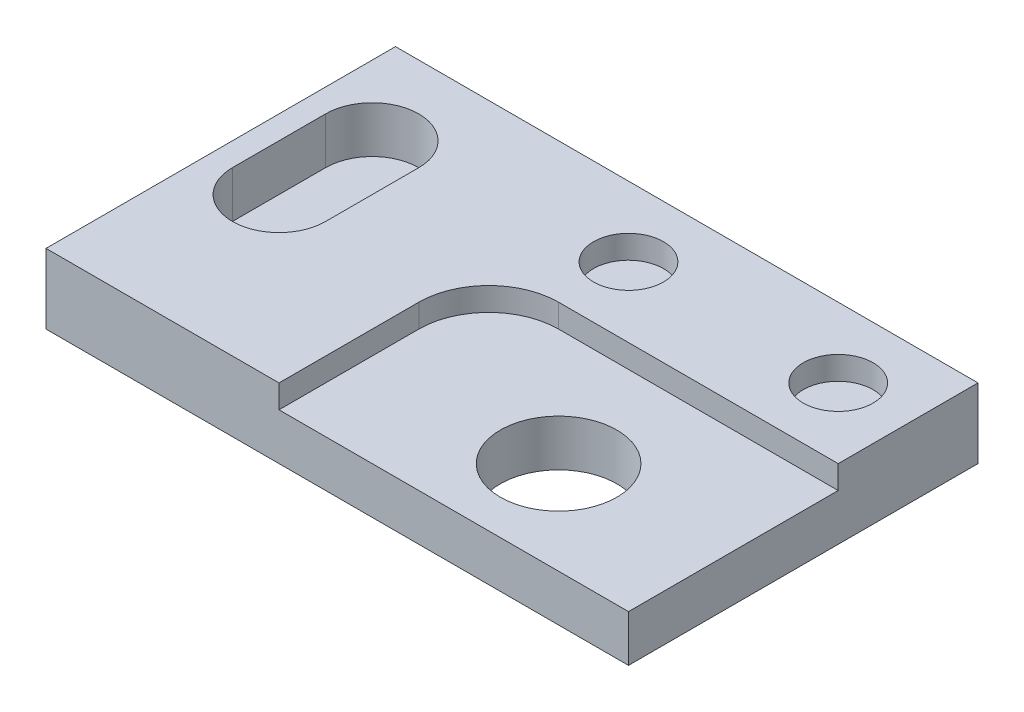
ISO-10303-21;
HEADER;
FILE_DESCRIPTION(('STEP AP214'),'2;1');
FILE_NAME('part.step','',(''),(''),'','','');
FILE_SCHEMA(('AUTOMOTIVE_DESIGN { 1 0 10303 214 1 1 1 1 }'));
ENDSEC;
DATA;
#1=APPLICATION_CONTEXT('core data for automotive mechanical design processes');
#2=APPLICATION_PROTOCOL_DEFINITION('international standard','automotive_design',2000,#1);
#3=PRODUCT_CONTEXT('',#1,'mechanical');
#4=PRODUCT('Part','Part','',(#3));
#5=PRODUCT_RELATED_PRODUCT_CATEGORY('part','',(#4));
#6=PRODUCT_DEFINITION_FORMATION('','',#4);
#7=PRODUCT_DEFINITION_CONTEXT('part definition',#1,'design');
#8=PRODUCT_DEFINITION('design','',#6,#7);
#9=PRODUCT_DEFINITION_SHAPE('','',#8);
#10=(LENGTH_UNIT() NAMED_UNIT(*) SI_UNIT(.MILLI.,.METRE.));
#11=(NAMED_UNIT(*) PLANE_ANGLE_UNIT() SI_UNIT($,.RADIAN.));
#12=(NAMED_UNIT(*) SI_UNIT($,.STERADIAN.) SOLID_ANGLE_UNIT());
#13=UNCERTAINTY_MEASURE_WITH_UNIT(LENGTH_MEASURE(1.E-05),#10,'distance_accuracy_value','');
#14=(GEOMETRIC_REPRESENTATION_CONTEXT(3) GLOBAL_UNCERTAINTY_ASSIGNED_CONTEXT((#13)) GLOBAL_UNIT_ASSIGNED_CONTEXT((#10,
#11,#12)) REPRESENTATION_CONTEXT('',''));
#15=CARTESIAN_POINT('',(0.,0.,0.));
#16=DIRECTION('',(0.,0.,1.));
#17=DIRECTION('',(1.,0.,0.));
#18=AXIS2_PLACEMENT_3D('',#15,#16,#17);
#19=CARTESIAN_POINT('',(-125.,-30.,75.));
#20=DIRECTION('',(0.,0.,1.));
#21=DIRECTION('',(1.,0.,0.));
#22=AXIS2_PLACEMENT_3D('',#19,#20,#21);
#23=PLANE('',#22);
#24=DIRECTION('',(1.,0.,0.));
#25=VECTOR('',#24,1.);
#26=CARTESIAN_POINT('',(0.,-10.,75.));
#27=LINE('',#26,#25);
#28=CARTESIAN_POINT('',(-25.,-10.,75.));
#29=VERTEX_POINT('',#28);
#30=CARTESIAN_POINT('',(125.,-10.,75.));
#31=VERTEX_POINT('',#30);
#32=EDGE_CURVE('E212',#29,#31,#27,.T.);
#33=ORIENTED_EDGE('',*,*,#32,.F.);
#34=DIRECTION('',(0.,1.,0.));
#35=VECTOR('',#34,1.);
#36=CARTESIAN_POINT('',(-25.,-10.,75.));
#37=LINE('',#36,#35);
#38=CARTESIAN_POINT('',(-25.,0.,75.));
#39=VERTEX_POINT('',#38);
#40=EDGE_CURVE('E232',#29,#39,#37,.T.);
#41=ORIENTED_EDGE('',*,*,#40,.T.);
#42=DIRECTION('',(1.,0.,0.));
#43=VECTOR('',#42,1.);
#44=CARTESIAN_POINT('',(-125.,0.,75.));
#45=LINE('',#44,#43);
#46=CARTESIAN_POINT('',(-125.,0.,75.));
#47=VERTEX_POINT('',#46);
#48=EDGE_CURVE('E328',#47,#39,#45,.T.);
#49=ORIENTED_EDGE('',*,*,#48,.F.);
#50=DIRECTION('',(0.,1.,0.));
#51=VECTOR('',#50,1.);
#52=CARTESIAN_POINT('',(-125.,-30.,75.));
#53=LINE('',#52,#51);
#54=CARTESIAN_POINT('',(-125.,-30.,75.));
#55=VERTEX_POINT('',#54);
#56=EDGE_CURVE('E82',#55,#47,#53,.T.);
#57=ORIENTED_EDGE('',*,*,#56,.F.);
#58=DIRECTION('',(1.,0.,0.));
#59=VECTOR('',#58,1.);
#60=CARTESIAN_POINT('',(-125.,-30.,75.));
#61=LINE('',#60,#59);
#62=CARTESIAN_POINT('',(125.,-30.,75.));
#63=VERTEX_POINT('',#62);
#64=EDGE_CURVE('E336',#55,#63,#61,.T.);
#65=ORIENTED_EDGE('',*,*,#64,.T.);
#66=DIRECTION('',(0.,1.,0.));
#67=VECTOR('',#66,1.);
#68=CARTESIAN_POINT('',(125.,-30.,75.));
#69=LINE('',#68,#67);
#70=EDGE_CURVE('E13',#63,#31,#69,.T.);
#71=ORIENTED_EDGE('',*,*,#70,.T.);
#72=EDGE_LOOP('',(#33,#41,#49,#57,#65,#71));
#73=FACE_BOUND('',#72,.T.);
#74=ADVANCED_FACE('F72',(#73),#23,.T.);
#75=CARTESIAN_POINT('',(55.,-30.,35.));
#76=DIRECTION('',(0.,1.,0.));
#77=DIRECTION('',(0.,0.,1.));
#78=AXIS2_PLACEMENT_3D('',#75,#76,#77);
#79=CYLINDRICAL_SURFACE('',#78,25.);
#80=CARTESIAN_POINT('',(55.,-30.,35.));
#81=DIRECTION('',(0.,1.,0.));
#82=DIRECTION('',(0.,0.,1.));
#83=AXIS2_PLACEMENT_3D('',#80,#81,#82);
#84=CIRCLE('',#83,25.);
#85=CARTESIAN_POINT('',(55.,-30.,60.));
#86=VERTEX_POINT('',#85);
#87=EDGE_CURVE('E231',#86,#86,#84,.T.);
#88=ORIENTED_EDGE('',*,*,#87,.F.);
#89=EDGE_LOOP('',(#88));
#90=FACE_BOUND('',#89,.T.);
#91=CARTESIAN_POINT('',(55.,-10.,35.));
#92=DIRECTION('',(0.,1.,0.));
#93=DIRECTION('',(0.,0.,1.));
#94=AXIS2_PLACEMENT_3D('',#91,#92,#93);
#95=CIRCLE('',#94,25.);
#96=CARTESIAN_POINT('',(55.,-10.,60.));
#97=VERTEX_POINT('',#96);
#98=EDGE_CURVE('E187',#97,#97,#95,.T.);
#99=ORIENTED_EDGE('',*,*,#98,.T.);
#100=EDGE_LOOP('',(#99));
#101=FACE_BOUND('',#100,.T.);
#102=ADVANCED_FACE('F392',(#90,#101),#79,.F.);
#103=CARTESIAN_POINT('',(125.,-30.,-75.));
#104=DIRECTION('',(1.,0.,0.));
#105=DIRECTION('',(0.,0.,-1.));
#106=AXIS2_PLACEMENT_3D('',#103,#104,#105);
#107=PLANE('',#106);
#108=DIRECTION('',(0.,1.,0.));
#109=VECTOR('',#108,1.);
#110=CARTESIAN_POINT('',(125.,-10.,-15.));
#111=LINE('',#110,#109);
#112=CARTESIAN_POINT('',(125.,-10.,-15.));
#113=VERTEX_POINT('',#112);
#114=CARTESIAN_POINT('',(125.,0.,-15.));
#115=VERTEX_POINT('',#114);
#116=EDGE_CURVE('E227',#113,#115,#111,.T.);
#117=ORIENTED_EDGE('',*,*,#116,.F.);
#118=DIRECTION('',(0.,0.,-1.));
#119=VECTOR('',#118,1.);
#120=CARTESIAN_POINT('',(125.,-10.,0.));
#121=LINE('',#120,#119);
#122=EDGE_CURVE('E172',#31,#113,#121,.T.);
#123=ORIENTED_EDGE('',*,*,#122,.F.);
#124=ORIENTED_EDGE('',*,*,#70,.F.);
#125=DIRECTION('',(0.,0.,-1.));
#126=VECTOR('',#125,1.);
#127=CARTESIAN_POINT('',(125.,-30.,-75.));
#128=LINE('',#127,#126);
#129=CARTESIAN_POINT('',(125.,-30.,-75.));
#130=VERTEX_POINT('',#129);
#131=EDGE_CURVE('E323',#63,#130,#128,.T.);
#132=ORIENTED_EDGE('',*,*,#131,.T.);
#133=DIRECTION('',(0.,1.,0.));
#134=VECTOR('',#133,1.);
#135=CARTESIAN_POINT('',(125.,-30.,-75.));
#136=LINE('',#135,#134);
#137=CARTESIAN_POINT('',(125.,0.,-75.));
#138=VERTEX_POINT('',#137);
#139=EDGE_CURVE('E76',#130,#138,#136,.T.);
#140=ORIENTED_EDGE('',*,*,#139,.T.);
#141=DIRECTION('',(0.,0.,-1.));
#142=VECTOR('',#141,1.);
#143=CARTESIAN_POINT('',(125.,0.,-75.));
#144=LINE('',#143,#142);
#145=EDGE_CURVE('E311',#115,#138,#144,.T.);
#146=ORIENTED_EDGE('',*,*,#145,.F.);
#147=EDGE_LOOP('',(#117,#123,#124,#132,#140,#146));
#148=FACE_BOUND('',#147,.T.);
#149=ADVANCED_FACE('F74',(#148),#107,.T.);
#150=CARTESIAN_POINT('',(-125.,-30.,-75.));
#151=DIRECTION('',(-1.,0.,0.));
#152=DIRECTION('',(0.,0.,1.));
#153=AXIS2_PLACEMENT_3D('',#150,#151,#152);
#154=PLANE('',#153);
#155=DIRECTION('',(0.,0.,1.));
#156=VECTOR('',#155,1.);
#157=CARTESIAN_POINT('',(-125.,0.,-75.));
#158=LINE('',#157,#156);
#159=CARTESIAN_POINT('',(-125.,0.,-75.));
#160=VERTEX_POINT('',#159);
#161=EDGE_CURVE('E346',#160,#47,#158,.T.);
#162=ORIENTED_EDGE('',*,*,#161,.F.);
#163=DIRECTION('',(0.,1.,0.));
#164=VECTOR('',#163,1.);
#165=CARTESIAN_POINT('',(-125.,-30.,-75.));
#166=LINE('',#165,#164);
#167=CARTESIAN_POINT('',(-125.,-30.,-75.));
#168=VERTEX_POINT('',#167);
#169=EDGE_CURVE('E354',#168,#160,#166,.T.);
#170=ORIENTED_EDGE('',*,*,#169,.F.);
#171=DIRECTION('',(0.,0.,1.));
#172=VECTOR('',#171,1.);
#173=CARTESIAN_POINT('',(-125.,-30.,-75.));
#174=LINE('',#173,#172);
#175=EDGE_CURVE('E332',#168,#55,#174,.T.);
#176=ORIENTED_EDGE('',*,*,#175,.T.);
#177=ORIENTED_EDGE('',*,*,#56,.T.);
#178=EDGE_LOOP('',(#162,#170,#176,#177));
#179=FACE_BOUND('',#178,.T.);
#180=ADVANCED_FACE('F385',(#179),#154,.T.);
#181=CARTESIAN_POINT('',(-125.,-30.,-75.));
#182=DIRECTION('',(0.,0.,-1.));
#183=DIRECTION('',(-1.,0.,0.));
#184=AXIS2_PLACEMENT_3D('',#181,#182,#183);
#185=PLANE('',#184);
#186=DIRECTION('',(-1.,0.,0.));
#187=VECTOR('',#186,1.);
#188=CARTESIAN_POINT('',(-125.,0.,-75.));
#189=LINE('',#188,#187);
#190=EDGE_CURVE('E342',#138,#160,#189,.T.);
#191=ORIENTED_EDGE('',*,*,#190,.F.);
#192=ORIENTED_EDGE('',*,*,#139,.F.);
#193=DIRECTION('',(-1.,0.,0.));
#194=VECTOR('',#193,1.);
#195=CARTESIAN_POINT('',(-125.,-30.,-75.));
#196=LINE('',#195,#194);
#197=EDGE_CURVE('E327',#130,#168,#196,.T.);
#198=ORIENTED_EDGE('',*,*,#197,.T.);
#199=ORIENTED_EDGE('',*,*,#169,.T.);
#200=EDGE_LOOP('',(#191,#192,#198,#199));
#201=FACE_BOUND('',#200,.T.);
#202=ADVANCED_FACE('F365',(#201),#185,.T.);
#203=CARTESIAN_POINT('',(0.,-30.,0.));
#204=DIRECTION('',(0.,1.,0.));
#205=DIRECTION('',(0.,0.,1.));
#206=AXIS2_PLACEMENT_3D('',#203,#204,#205);
#207=PLANE('',#206);
#208=ORIENTED_EDGE('',*,*,#87,.T.);
#209=EDGE_LOOP('',(#208));
#210=FACE_BOUND('',#209,.T.);
#211=ORIENTED_EDGE('',*,*,#131,.F.);
#212=ORIENTED_EDGE('',*,*,#64,.F.);
#213=ORIENTED_EDGE('',*,*,#175,.F.);
#214=ORIENTED_EDGE('',*,*,#197,.F.);
#215=EDGE_LOOP('',(#211,#212,#213,#214));
#216=FACE_BOUND('',#215,.T.);
#217=ADVANCED_FACE('F382',(#210,#216),#207,.F.);
#218=CARTESIAN_POINT('',(0.,0.,0.));
#219=DIRECTION('',(0.,1.,0.));
#220=DIRECTION('',(0.,0.,1.));
#221=AXIS2_PLACEMENT_3D('',#218,#219,#220);
#222=PLANE('',#221);
#223=DIRECTION('',(-1.,0.,0.));
#224=VECTOR('',#223,1.);
#225=CARTESIAN_POINT('',(0.,0.,-15.));
#226=LINE('',#225,#224);
#227=CARTESIAN_POINT('',(5.00000000000019,0.,-15.));
#228=VERTEX_POINT('',#227);
#229=EDGE_CURVE('E90',#115,#228,#226,.T.);
#230=ORIENTED_EDGE('',*,*,#229,.F.);
#231=ORIENTED_EDGE('',*,*,#145,.T.);
#232=ORIENTED_EDGE('',*,*,#190,.T.);
#233=ORIENTED_EDGE('',*,*,#161,.T.);
#234=ORIENTED_EDGE('',*,*,#48,.T.);
#235=DIRECTION('',(0.,0.,-1.));
#236=VECTOR('',#235,1.);
#237=CARTESIAN_POINT('',(-25.,0.,0.));
#238=LINE('',#237,#236);
#239=CARTESIAN_POINT('',(-25.,0.,15.0000000000002));
#240=VERTEX_POINT('',#239);
#241=EDGE_CURVE('E195',#39,#240,#238,.T.);
#242=ORIENTED_EDGE('',*,*,#241,.T.);
#243=CARTESIAN_POINT('',(4.99999999999998,0.,15.));
#244=DIRECTION('',(0.,1.,0.));
#245=DIRECTION('',(0.,0.,1.));
#246=AXIS2_PLACEMENT_3D('',#243,#244,#245);
#247=CIRCLE('',#246,30.);
#248=EDGE_CURVE('E216',#228,#240,#247,.T.);
#249=ORIENTED_EDGE('',*,*,#248,.F.);
#250=EDGE_LOOP('',(#230,#231,#232,#233,#234,#242,#249));
#251=FACE_BOUND('',#250,.T.);
#252=CARTESIAN_POINT('',(4.99999999999998,0.,-45.));
#253=DIRECTION('',(0.,1.,0.));
#254=DIRECTION('',(0.,0.,1.));
#255=AXIS2_PLACEMENT_3D('',#252,#253,#254);
#256=CIRCLE('',#255,15.);
#257=CARTESIAN_POINT('',(4.99999999999998,0.,-30.));
#258=VERTEX_POINT('',#257);
#259=EDGE_CURVE('E254',#258,#258,#256,.T.);
#260=ORIENTED_EDGE('',*,*,#259,.F.);
#261=EDGE_LOOP('',(#260));
#262=FACE_BOUND('',#261,.T.);
#263=CARTESIAN_POINT('',(95.,0.,-45.));
#264=DIRECTION('',(0.,1.,0.));
#265=DIRECTION('',(0.,0.,1.));
#266=AXIS2_PLACEMENT_3D('',#263,#264,#265);
#267=CIRCLE('',#266,15.);
#268=CARTESIAN_POINT('',(95.,0.,-30.));
#269=VERTEX_POINT('',#268);
#270=EDGE_CURVE('E247',#269,#269,#267,.T.);
#271=ORIENTED_EDGE('',*,*,#270,.F.);
#272=EDGE_LOOP('',(#271));
#273=FACE_BOUND('',#272,.T.);
#274=DIRECTION('',(0.,0.,1.));
#275=VECTOR('',#274,1.);
#276=CARTESIAN_POINT('',(-115.,0.,0.));
#277=LINE('',#276,#275);
#278=CARTESIAN_POINT('',(-115.,0.,-35.));
#279=VERTEX_POINT('',#278);
#280=CARTESIAN_POINT('',(-115.,0.,5.));
#281=VERTEX_POINT('',#280);
#282=EDGE_CURVE('E253',#279,#281,#277,.T.);
#283=ORIENTED_EDGE('',*,*,#282,.F.);
#284=CARTESIAN_POINT('',(-95.,0.,-35.));
#285=DIRECTION('',(0.,1.,0.));
#286=DIRECTION('',(0.,0.,1.));
#287=AXIS2_PLACEMENT_3D('',#284,#285,#286);
#288=CIRCLE('',#287,20.);
#289=CARTESIAN_POINT('',(-75.,0.,-35.));
#290=VERTEX_POINT('',#289);
#291=EDGE_CURVE('E276',#290,#279,#288,.T.);
#292=ORIENTED_EDGE('',*,*,#291,.F.);
#293=DIRECTION('',(0.,0.,1.));
#294=VECTOR('',#293,1.);
#295=CARTESIAN_POINT('',(-75.,0.,0.));
#296=LINE('',#295,#294);
#297=CARTESIAN_POINT('',(-75.,0.,5.));
#298=VERTEX_POINT('',#297);
#299=EDGE_CURVE('E98',#290,#298,#296,.T.);
#300=ORIENTED_EDGE('',*,*,#299,.T.);
#301=CARTESIAN_POINT('',(-95.,0.,5.));
#302=DIRECTION('',(0.,1.,0.));
#303=DIRECTION('',(0.,0.,1.));
#304=AXIS2_PLACEMENT_3D('',#301,#302,#303);
#305=CIRCLE('',#304,20.);
#306=EDGE_CURVE('E297',#281,#298,#305,.T.);
#307=ORIENTED_EDGE('',*,*,#306,.F.);
#308=EDGE_LOOP('',(#283,#292,#300,#307));
#309=FACE_BOUND('',#308,.T.);
#310=ADVANCED_FACE('F367',(#251,#262,#273,#309),#222,.T.);
#311=CARTESIAN_POINT('',(-115.,-20.,0.));
#312=DIRECTION('',(-1.,0.,0.));
#313=DIRECTION('',(0.,0.,1.));
#314=AXIS2_PLACEMENT_3D('',#311,#312,#313);
#315=PLANE('',#314);
#316=ORIENTED_EDGE('',*,*,#282,.T.);
#317=DIRECTION('',(0.,1.,0.));
#318=VECTOR('',#317,1.);
#319=CARTESIAN_POINT('',(-115.,-20.,5.));
#320=LINE('',#319,#318);
#321=CARTESIAN_POINT('',(-115.,-20.,5.));
#322=VERTEX_POINT('',#321);
#323=EDGE_CURVE('E292',#322,#281,#320,.T.);
#324=ORIENTED_EDGE('',*,*,#323,.F.);
#325=DIRECTION('',(0.,0.,1.));
#326=VECTOR('',#325,1.);
#327=CARTESIAN_POINT('',(-115.,-20.,0.));
#328=LINE('',#327,#326);
#329=CARTESIAN_POINT('',(-115.,-20.,-35.));
#330=VERTEX_POINT('',#329);
#331=EDGE_CURVE('E270',#330,#322,#328,.T.);
#332=ORIENTED_EDGE('',*,*,#331,.F.);
#333=DIRECTION('',(0.,1.,0.));
#334=VECTOR('',#333,1.);
#335=CARTESIAN_POINT('',(-115.,-20.,-35.));
#336=LINE('',#335,#334);
#337=EDGE_CURVE('E308',#330,#279,#336,.T.);
#338=ORIENTED_EDGE('',*,*,#337,.T.);
#339=EDGE_LOOP('',(#316,#324,#332,#338));
#340=FACE_BOUND('',#339,.T.);
#341=ADVANCED_FACE('F403',(#340),#315,.F.);
#342=CARTESIAN_POINT('',(-95.,-20.,5.));
#343=DIRECTION('',(0.,1.,0.));
#344=DIRECTION('',(0.,0.,1.));
#345=AXIS2_PLACEMENT_3D('',#342,#343,#344);
#346=CYLINDRICAL_SURFACE('',#345,20.);
#347=ORIENTED_EDGE('',*,*,#306,.T.);
#348=DIRECTION('',(0.,1.,0.));
#349=VECTOR('',#348,1.);
#350=CARTESIAN_POINT('',(-75.,-20.,5.));
#351=LINE('',#350,#349);
#352=CARTESIAN_POINT('',(-75.,-20.,5.));
#353=VERTEX_POINT('',#352);
#354=EDGE_CURVE('E317',#353,#298,#351,.T.);
#355=ORIENTED_EDGE('',*,*,#354,.F.);
#356=CARTESIAN_POINT('',(-95.,-20.,5.));
#357=DIRECTION('',(0.,1.,0.));
#358=DIRECTION('',(0.,0.,1.));
#359=AXIS2_PLACEMENT_3D('',#356,#357,#358);
#360=CIRCLE('',#359,20.);
#361=EDGE_CURVE('E275',#322,#353,#360,.T.);
#362=ORIENTED_EDGE('',*,*,#361,.F.);
#363=ORIENTED_EDGE('',*,*,#323,.T.);
#364=EDGE_LOOP('',(#347,#355,#362,#363));
#365=FACE_BOUND('',#364,.T.);
#366=ADVANCED_FACE('F409',(#365),#346,.F.);
#367=CARTESIAN_POINT('',(-75.,-20.,0.));
#368=DIRECTION('',(-1.,0.,0.));
#369=DIRECTION('',(0.,0.,1.));
#370=AXIS2_PLACEMENT_3D('',#367,#368,#369);
#371=PLANE('',#370);
#372=ORIENTED_EDGE('',*,*,#299,.F.);
#373=DIRECTION('',(0.,1.,0.));
#374=VECTOR('',#373,1.);
#375=CARTESIAN_POINT('',(-75.,-20.,-35.));
#376=LINE('',#375,#374);
#377=CARTESIAN_POINT('',(-75.,-20.,-35.));
#378=VERTEX_POINT('',#377);
#379=EDGE_CURVE('E312',#378,#290,#376,.T.);
#380=ORIENTED_EDGE('',*,*,#379,.F.);
#381=DIRECTION('',(0.,0.,1.));
#382=VECTOR('',#381,1.);
#383=CARTESIAN_POINT('',(-75.,-20.,0.));
#384=LINE('',#383,#382);
#385=EDGE_CURVE('E284',#378,#353,#384,.T.);
#386=ORIENTED_EDGE('',*,*,#385,.T.);
#387=ORIENTED_EDGE('',*,*,#354,.T.);
#388=EDGE_LOOP('',(#372,#380,#386,#387));
#389=FACE_BOUND('',#388,.T.);
#390=ADVANCED_FACE('F413',(#389),#371,.T.);
#391=CARTESIAN_POINT('',(-95.,-20.,-35.));
#392=DIRECTION('',(0.,1.,0.));
#393=DIRECTION('',(0.,0.,1.));
#394=AXIS2_PLACEMENT_3D('',#391,#392,#393);
#395=CYLINDRICAL_SURFACE('',#394,20.);
#396=ORIENTED_EDGE('',*,*,#291,.T.);
#397=ORIENTED_EDGE('',*,*,#337,.F.);
#398=CARTESIAN_POINT('',(-95.,-20.,-35.));
#399=DIRECTION('',(0.,1.,0.));
#400=DIRECTION('',(0.,0.,1.));
#401=AXIS2_PLACEMENT_3D('',#398,#399,#400);
#402=CIRCLE('',#401,20.);
#403=EDGE_CURVE('E287',#378,#330,#402,.T.);
#404=ORIENTED_EDGE('',*,*,#403,.F.);
#405=ORIENTED_EDGE('',*,*,#379,.T.);
#406=EDGE_LOOP('',(#396,#397,#404,#405));
#407=FACE_BOUND('',#406,.T.);
#408=ADVANCED_FACE('F417',(#407),#395,.F.);
#409=CARTESIAN_POINT('',(0.,-20.,0.));
#410=DIRECTION('',(0.,1.,0.));
#411=DIRECTION('',(0.,0.,1.));
#412=AXIS2_PLACEMENT_3D('',#409,#410,#411);
#413=PLANE('',#412);
#414=ORIENTED_EDGE('',*,*,#331,.T.);
#415=ORIENTED_EDGE('',*,*,#361,.T.);
#416=ORIENTED_EDGE('',*,*,#385,.F.);
#417=ORIENTED_EDGE('',*,*,#403,.T.);
#418=EDGE_LOOP('',(#414,#415,#416,#417));
#419=FACE_BOUND('',#418,.T.);
#420=ADVANCED_FACE('F420',(#419),#413,.T.);
#421=CARTESIAN_POINT('',(95.,-10.,-45.));
#422=DIRECTION('',(0.,1.,0.));
#423=DIRECTION('',(0.,0.,1.));
#424=AXIS2_PLACEMENT_3D('',#421,#422,#423);
#425=CYLINDRICAL_SURFACE('',#424,15.);
#426=CARTESIAN_POINT('',(95.,-10.,-45.));
#427=DIRECTION('',(0.,1.,0.));
#428=DIRECTION('',(0.,0.,1.));
#429=AXIS2_PLACEMENT_3D('',#426,#427,#428);
#430=CIRCLE('',#429,15.);
#431=CARTESIAN_POINT('',(95.,-10.,-30.));
#432=VERTEX_POINT('',#431);
#433=EDGE_CURVE('E262',#432,#432,#430,.T.);
#434=ORIENTED_EDGE('',*,*,#433,.F.);
#435=EDGE_LOOP('',(#434));
#436=FACE_BOUND('',#435,.T.);
#437=ORIENTED_EDGE('',*,*,#270,.T.);
#438=EDGE_LOOP('',(#437));
#439=FACE_BOUND('',#438,.T.);
#440=ADVANCED_FACE('F424',(#436,#439),#425,.F.);
#441=CARTESIAN_POINT('',(0.,-10.,0.));
#442=DIRECTION('',(0.,1.,0.));
#443=DIRECTION('',(0.,0.,1.));
#444=AXIS2_PLACEMENT_3D('',#441,#442,#443);
#445=PLANE('',#444);
#446=ORIENTED_EDGE('',*,*,#433,.T.);
#447=EDGE_LOOP('',(#446));
#448=FACE_BOUND('',#447,.T.);
#449=ADVANCED_FACE('F428',(#448),#445,.T.);
#450=CARTESIAN_POINT('',(4.99999999999998,-10.,-45.));
#451=DIRECTION('',(0.,1.,0.));
#452=DIRECTION('',(0.,0.,1.));
#453=AXIS2_PLACEMENT_3D('',#450,#451,#452);
#454=CYLINDRICAL_SURFACE('',#453,15.);
#455=CARTESIAN_POINT('',(4.99999999999998,-10.,-45.));
#456=DIRECTION('',(0.,1.,0.));
#457=DIRECTION('',(0.,0.,1.));
#458=AXIS2_PLACEMENT_3D('',#455,#456,#457);
#459=CIRCLE('',#458,15.);
#460=CARTESIAN_POINT('',(4.99999999999998,-10.,-30.));
#461=VERTEX_POINT('',#460);
#462=EDGE_CURVE('E248',#461,#461,#459,.T.);
#463=ORIENTED_EDGE('',*,*,#462,.F.);
#464=EDGE_LOOP('',(#463));
#465=FACE_BOUND('',#464,.T.);
#466=ORIENTED_EDGE('',*,*,#259,.T.);
#467=EDGE_LOOP('',(#466));
#468=FACE_BOUND('',#467,.T.);
#469=ADVANCED_FACE('F432',(#465,#468),#454,.F.);
#470=CARTESIAN_POINT('',(0.,-10.,0.));
#471=DIRECTION('',(0.,1.,0.));
#472=DIRECTION('',(0.,0.,1.));
#473=AXIS2_PLACEMENT_3D('',#470,#471,#472);
#474=PLANE('',#473);
#475=ORIENTED_EDGE('',*,*,#462,.T.);
#476=EDGE_LOOP('',(#475));
#477=FACE_BOUND('',#476,.T.);
#478=ADVANCED_FACE('F436',(#477),#474,.T.);
#479=CARTESIAN_POINT('',(0.,-10.,-15.));
#480=DIRECTION('',(0.,0.,-1.));
#481=DIRECTION('',(-1.,0.,0.));
#482=AXIS2_PLACEMENT_3D('',#479,#480,#481);
#483=PLANE('',#482);
#484=ORIENTED_EDGE('',*,*,#229,.T.);
#485=DIRECTION('',(0.,1.,0.));
#486=VECTOR('',#485,1.);
#487=CARTESIAN_POINT('',(5.00000000000019,-10.,-15.));
#488=LINE('',#487,#486);
#489=CARTESIAN_POINT('',(5.00000000000019,-10.,-15.));
#490=VERTEX_POINT('',#489);
#491=EDGE_CURVE('E161',#490,#228,#488,.T.);
#492=ORIENTED_EDGE('',*,*,#491,.F.);
#493=DIRECTION('',(-1.,0.,0.));
#494=VECTOR('',#493,1.);
#495=CARTESIAN_POINT('',(0.,-10.,-15.));
#496=LINE('',#495,#494);
#497=EDGE_CURVE('E165',#113,#490,#496,.T.);
#498=ORIENTED_EDGE('',*,*,#497,.F.);
#499=ORIENTED_EDGE('',*,*,#116,.T.);
#500=EDGE_LOOP('',(#484,#492,#498,#499));
#501=FACE_BOUND('',#500,.T.);
#502=ADVANCED_FACE('F163',(#501),#483,.F.);
#503=CARTESIAN_POINT('',(-25.,-10.,0.));
#504=DIRECTION('',(1.,0.,0.));
#505=DIRECTION('',(0.,0.,-1.));
#506=AXIS2_PLACEMENT_3D('',#503,#504,#505);
#507=PLANE('',#506);
#508=ORIENTED_EDGE('',*,*,#241,.F.);
#509=ORIENTED_EDGE('',*,*,#40,.F.);
#510=DIRECTION('',(0.,0.,-1.));
#511=VECTOR('',#510,1.);
#512=CARTESIAN_POINT('',(-25.,-10.,0.));
#513=LINE('',#512,#511);
#514=CARTESIAN_POINT('',(-25.,-10.,15.0000000000002));
#515=VERTEX_POINT('',#514);
#516=EDGE_CURVE('E181',#29,#515,#513,.T.);
#517=ORIENTED_EDGE('',*,*,#516,.T.);
#518=DIRECTION('',(0.,1.,0.));
#519=VECTOR('',#518,1.);
#520=CARTESIAN_POINT('',(-25.,-10.,15.0000000000002));
#521=LINE('',#520,#519);
#522=EDGE_CURVE('E171',#515,#240,#521,.T.);
#523=ORIENTED_EDGE('',*,*,#522,.T.);
#524=EDGE_LOOP('',(#508,#509,#517,#523));
#525=FACE_BOUND('',#524,.T.);
#526=ADVANCED_FACE('F377',(#525),#507,.T.);
#527=CARTESIAN_POINT('',(4.99999999999998,-10.,15.));
#528=DIRECTION('',(0.,1.,0.));
#529=DIRECTION('',(0.,0.,1.));
#530=AXIS2_PLACEMENT_3D('',#527,#528,#529);
#531=CYLINDRICAL_SURFACE('',#530,30.);
#532=ORIENTED_EDGE('',*,*,#248,.T.);
#533=ORIENTED_EDGE('',*,*,#522,.F.);
#534=CARTESIAN_POINT('',(4.99999999999998,-10.,15.));
#535=DIRECTION('',(0.,1.,0.));
#536=DIRECTION('',(0.,0.,1.));
#537=AXIS2_PLACEMENT_3D('',#534,#535,#536);
#538=CIRCLE('',#537,30.);
#539=EDGE_CURVE('E176',#490,#515,#538,.T.);
#540=ORIENTED_EDGE('',*,*,#539,.F.);
#541=ORIENTED_EDGE('',*,*,#491,.T.);
#542=EDGE_LOOP('',(#532,#533,#540,#541));
#543=FACE_BOUND('',#542,.T.);
#544=ADVANCED_FACE('F177',(#543),#531,.F.);
#545=CARTESIAN_POINT('',(0.,-10.,0.));
#546=DIRECTION('',(0.,1.,0.));
#547=DIRECTION('',(0.,0.,1.));
#548=AXIS2_PLACEMENT_3D('',#545,#546,#547);
#549=PLANE('',#548);
#550=ORIENTED_EDGE('',*,*,#98,.F.);
#551=EDGE_LOOP('',(#550));
#552=FACE_BOUND('',#551,.T.);
#553=ORIENTED_EDGE('',*,*,#497,.T.);
#554=ORIENTED_EDGE('',*,*,#539,.T.);
#555=ORIENTED_EDGE('',*,*,#516,.F.);
#556=ORIENTED_EDGE('',*,*,#32,.T.);
#557=ORIENTED_EDGE('',*,*,#122,.T.);
#558=EDGE_LOOP('',(#553,#554,#555,#556,#557));
#559=FACE_BOUND('',#558,.T.);
#560=ADVANCED_FACE('F183',(#552,#559),#549,.T.);
#561=CLOSED_SHELL('',(#74,#102,#149,#180,#202,#217,#310,#341,#366,#390,#408,#420,#440,#449,#469,
#478,#502,#526,#544,#560));
#562=MANIFOLD_SOLID_BREP('B2',#561);
#563=ADVANCED_BREP_SHAPE_REPRESENTATION('',(#18,#562),#14);
#564=SHAPE_DEFINITION_REPRESENTATION(#9,#563);
ENDSEC;
END-ISO-10303-21;
